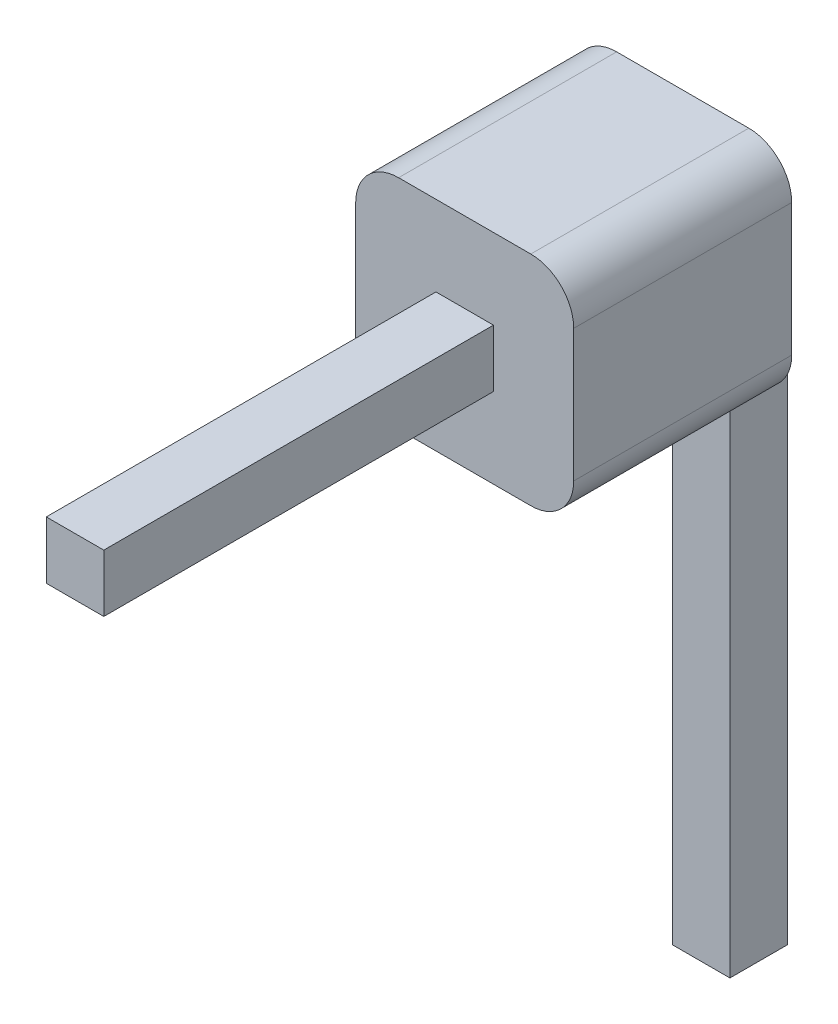
ISO-10303-21;
HEADER;
FILE_DESCRIPTION(('STEP AP214'),'2;1');
FILE_NAME('part.step','',(''),(''),'','','');
FILE_SCHEMA(('AUTOMOTIVE_DESIGN { 1 0 10303 214 1 1 1 1 }'));
ENDSEC;
DATA;
#1=APPLICATION_CONTEXT('core data for automotive mechanical design processes');
#2=APPLICATION_PROTOCOL_DEFINITION('international standard','automotive_design',2000,#1);
#3=PRODUCT_CONTEXT('',#1,'mechanical');
#4=PRODUCT('Part','Part','',(#3));
#5=PRODUCT_RELATED_PRODUCT_CATEGORY('part','',(#4));
#6=PRODUCT_DEFINITION_FORMATION('','',#4);
#7=PRODUCT_DEFINITION_CONTEXT('part definition',#1,'design');
#8=PRODUCT_DEFINITION('design','',#6,#7);
#9=PRODUCT_DEFINITION_SHAPE('','',#8);
#10=(LENGTH_UNIT() NAMED_UNIT(*) SI_UNIT(.MILLI.,.METRE.));
#11=(NAMED_UNIT(*) PLANE_ANGLE_UNIT() SI_UNIT($,.RADIAN.));
#12=(NAMED_UNIT(*) SI_UNIT($,.STERADIAN.) SOLID_ANGLE_UNIT());
#13=UNCERTAINTY_MEASURE_WITH_UNIT(LENGTH_MEASURE(1.E-05),#10,'distance_accuracy_value','');
#14=(GEOMETRIC_REPRESENTATION_CONTEXT(3) GLOBAL_UNCERTAINTY_ASSIGNED_CONTEXT((#13)) GLOBAL_UNIT_ASSIGNED_CONTEXT((#10,
#11,#12)) REPRESENTATION_CONTEXT('',''));
#15=CARTESIAN_POINT('',(0.,0.,0.));
#16=DIRECTION('',(0.,0.,1.));
#17=DIRECTION('',(1.,0.,0.));
#18=AXIS2_PLACEMENT_3D('',#15,#16,#17);
#19=CARTESIAN_POINT('',(-1.27,-0.0190907262086213,2.54));
#20=DIRECTION('',(0.,0.,1.));
#21=DIRECTION('',(1.,0.,0.));
#22=AXIS2_PLACEMENT_3D('',#19,#20,#21);
#23=PLANE('',#22);
#24=DIRECTION('',(1.,0.,0.));
#25=VECTOR('',#24,1.);
#26=CARTESIAN_POINT('',(-1.27,-2.55909072620862,2.54));
#27=LINE('',#26,#25);
#28=CARTESIAN_POINT('',(-0.769999999999999,-2.55909072620862,2.54));
#29=VERTEX_POINT('',#28);
#30=CARTESIAN_POINT('',(0.770000000000001,-2.55909072620862,2.54));
#31=VERTEX_POINT('',#30);
#32=EDGE_CURVE('E245',#29,#31,#27,.T.);
#33=ORIENTED_EDGE('',*,*,#32,.T.);
#34=CARTESIAN_POINT('',(0.770000000000001,-2.05909072620862,2.54));
#35=DIRECTION('',(0.,0.,1.));
#36=DIRECTION('',(1.,0.,0.));
#37=AXIS2_PLACEMENT_3D('',#34,#35,#36);
#38=CIRCLE('',#37,0.5);
#39=CARTESIAN_POINT('',(1.27,-2.05909072620862,2.54));
#40=VERTEX_POINT('',#39);
#41=EDGE_CURVE('E289',#31,#40,#38,.T.);
#42=ORIENTED_EDGE('',*,*,#41,.T.);
#43=DIRECTION('',(0.,1.,0.));
#44=VECTOR('',#43,1.);
#45=CARTESIAN_POINT('',(1.27,-0.019090726208621,2.54));
#46=LINE('',#45,#44);
#47=CARTESIAN_POINT('',(1.27,-0.519090726208621,2.54));
#48=VERTEX_POINT('',#47);
#49=EDGE_CURVE('E248',#40,#48,#46,.T.);
#50=ORIENTED_EDGE('',*,*,#49,.T.);
#51=CARTESIAN_POINT('',(0.770000000000001,-0.519090726208621,2.54));
#52=DIRECTION('',(0.,0.,1.));
#53=DIRECTION('',(1.,0.,0.));
#54=AXIS2_PLACEMENT_3D('',#51,#52,#53);
#55=CIRCLE('',#54,0.5);
#56=CARTESIAN_POINT('',(0.770000000000001,-0.019090726208621,2.54));
#57=VERTEX_POINT('',#56);
#58=EDGE_CURVE('E49',#48,#57,#55,.T.);
#59=ORIENTED_EDGE('',*,*,#58,.T.);
#60=DIRECTION('',(-1.,0.,0.));
#61=VECTOR('',#60,1.);
#62=CARTESIAN_POINT('',(-1.27,-0.0190907262086213,2.54));
#63=LINE('',#62,#61);
#64=CARTESIAN_POINT('',(-0.77,-0.0190907262086212,2.54));
#65=VERTEX_POINT('',#64);
#66=EDGE_CURVE('E250',#57,#65,#63,.T.);
#67=ORIENTED_EDGE('',*,*,#66,.T.);
#68=CARTESIAN_POINT('',(-0.769999999999999,-0.519090726208621,2.54));
#69=DIRECTION('',(0.,0.,1.));
#70=DIRECTION('',(1.,0.,0.));
#71=AXIS2_PLACEMENT_3D('',#68,#69,#70);
#72=CIRCLE('',#71,0.5);
#73=CARTESIAN_POINT('',(-1.27,-0.519090726208621,2.54));
#74=VERTEX_POINT('',#73);
#75=EDGE_CURVE('E285',#65,#74,#72,.T.);
#76=ORIENTED_EDGE('',*,*,#75,.T.);
#77=DIRECTION('',(0.,-1.,0.));
#78=VECTOR('',#77,1.);
#79=CARTESIAN_POINT('',(-1.27,-0.0190907262086213,2.54));
#80=LINE('',#79,#78);
#81=CARTESIAN_POINT('',(-1.27,-2.05909072620862,2.54));
#82=VERTEX_POINT('',#81);
#83=EDGE_CURVE('E242',#74,#82,#80,.T.);
#84=ORIENTED_EDGE('',*,*,#83,.T.);
#85=CARTESIAN_POINT('',(-0.769999999999999,-2.05909072620862,2.54));
#86=DIRECTION('',(0.,0.,1.));
#87=DIRECTION('',(1.,0.,0.));
#88=AXIS2_PLACEMENT_3D('',#85,#86,#87);
#89=CIRCLE('',#88,0.5);
#90=EDGE_CURVE('E287',#82,#29,#89,.T.);
#91=ORIENTED_EDGE('',*,*,#90,.T.);
#92=EDGE_LOOP('',(#33,#42,#50,#59,#67,#76,#84,#91));
#93=FACE_BOUND('',#92,.T.);
#94=DIRECTION('',(1.,0.,0.));
#95=VECTOR('',#94,1.);
#96=CARTESIAN_POINT('',(-1.27,-0.954090726208621,2.54));
#97=LINE('',#96,#95);
#98=CARTESIAN_POINT('',(-0.335,-0.954090726208621,2.54));
#99=VERTEX_POINT('',#98);
#100=CARTESIAN_POINT('',(0.335,-0.954090726208621,2.54));
#101=VERTEX_POINT('',#100);
#102=EDGE_CURVE('E262',#99,#101,#97,.T.);
#103=ORIENTED_EDGE('',*,*,#102,.T.);
#104=DIRECTION('',(0.,-1.,0.));
#105=VECTOR('',#104,1.);
#106=CARTESIAN_POINT('',(0.335000000000001,-0.0190907262086233,2.54));
#107=LINE('',#106,#105);
#108=CARTESIAN_POINT('',(0.334999999999999,-1.62409072620862,2.54));
#109=VERTEX_POINT('',#108);
#110=EDGE_CURVE('E229',#101,#109,#107,.T.);
#111=ORIENTED_EDGE('',*,*,#110,.T.);
#112=DIRECTION('',(-1.,0.,0.));
#113=VECTOR('',#112,1.);
#114=CARTESIAN_POINT('',(-1.27,-1.62409072620862,2.54));
#115=LINE('',#114,#113);
#116=CARTESIAN_POINT('',(-0.335,-1.62409072620862,2.54));
#117=VERTEX_POINT('',#116);
#118=EDGE_CURVE('E161',#109,#117,#115,.T.);
#119=ORIENTED_EDGE('',*,*,#118,.T.);
#120=DIRECTION('',(0.,1.,0.));
#121=VECTOR('',#120,1.);
#122=CARTESIAN_POINT('',(-0.335,-0.0190907262086213,2.54));
#123=LINE('',#122,#121);
#124=EDGE_CURVE('E226',#117,#99,#123,.T.);
#125=ORIENTED_EDGE('',*,*,#124,.T.);
#126=EDGE_LOOP('',(#103,#111,#119,#125));
#127=FACE_BOUND('',#126,.T.);
#128=ADVANCED_FACE('F29',(#93,#127),#23,.T.);
#129=CARTESIAN_POINT('',(-1.27,-0.0190907262086213,0.));
#130=DIRECTION('',(0.,0.,1.));
#131=DIRECTION('',(1.,0.,0.));
#132=AXIS2_PLACEMENT_3D('',#129,#130,#131);
#133=PLANE('',#132);
#134=DIRECTION('',(0.,1.,0.));
#135=VECTOR('',#134,1.);
#136=CARTESIAN_POINT('',(1.27,-0.019090726208621,0.));
#137=LINE('',#136,#135);
#138=CARTESIAN_POINT('',(1.27,-2.05909072620862,0.));
#139=VERTEX_POINT('',#138);
#140=CARTESIAN_POINT('',(1.27,-0.519090726208621,0.));
#141=VERTEX_POINT('',#140);
#142=EDGE_CURVE('E237',#139,#141,#137,.T.);
#143=ORIENTED_EDGE('',*,*,#142,.F.);
#144=CARTESIAN_POINT('',(0.770000000000001,-2.05909072620862,0.));
#145=DIRECTION('',(0.,0.,1.));
#146=DIRECTION('',(1.,0.,0.));
#147=AXIS2_PLACEMENT_3D('',#144,#145,#146);
#148=CIRCLE('',#147,0.5);
#149=CARTESIAN_POINT('',(0.770000000000001,-2.55909072620862,0.));
#150=VERTEX_POINT('',#149);
#151=EDGE_CURVE('E277',#139,#150,#148,.F.);
#152=ORIENTED_EDGE('',*,*,#151,.T.);
#153=DIRECTION('',(1.,0.,0.));
#154=VECTOR('',#153,1.);
#155=CARTESIAN_POINT('',(-1.27,-2.55909072620862,0.));
#156=LINE('',#155,#154);
#157=CARTESIAN_POINT('',(-0.769999999999999,-2.55909072620862,0.));
#158=VERTEX_POINT('',#157);
#159=EDGE_CURVE('E234',#158,#150,#156,.T.);
#160=ORIENTED_EDGE('',*,*,#159,.F.);
#161=CARTESIAN_POINT('',(-0.769999999999999,-2.05909072620862,0.));
#162=DIRECTION('',(0.,0.,1.));
#163=DIRECTION('',(1.,0.,0.));
#164=AXIS2_PLACEMENT_3D('',#161,#162,#163);
#165=CIRCLE('',#164,0.5);
#166=CARTESIAN_POINT('',(-1.27,-2.05909072620862,0.));
#167=VERTEX_POINT('',#166);
#168=EDGE_CURVE('E275',#158,#167,#165,.F.);
#169=ORIENTED_EDGE('',*,*,#168,.T.);
#170=DIRECTION('',(0.,-1.,0.));
#171=VECTOR('',#170,1.);
#172=CARTESIAN_POINT('',(-1.27,-0.0190907262086213,0.));
#173=LINE('',#172,#171);
#174=CARTESIAN_POINT('',(-1.27,-0.519090726208621,0.));
#175=VERTEX_POINT('',#174);
#176=EDGE_CURVE('E231',#175,#167,#173,.T.);
#177=ORIENTED_EDGE('',*,*,#176,.F.);
#178=CARTESIAN_POINT('',(-0.769999999999999,-0.519090726208621,0.));
#179=DIRECTION('',(0.,0.,1.));
#180=DIRECTION('',(1.,0.,0.));
#181=AXIS2_PLACEMENT_3D('',#178,#179,#180);
#182=CIRCLE('',#181,0.5);
#183=CARTESIAN_POINT('',(-0.77,-0.0190907262086212,0.));
#184=VERTEX_POINT('',#183);
#185=EDGE_CURVE('E273',#175,#184,#182,.F.);
#186=ORIENTED_EDGE('',*,*,#185,.T.);
#187=DIRECTION('',(-1.,0.,0.));
#188=VECTOR('',#187,1.);
#189=CARTESIAN_POINT('',(-1.27,-0.0190907262086213,0.));
#190=LINE('',#189,#188);
#191=CARTESIAN_POINT('',(0.770000000000001,-0.019090726208621,0.));
#192=VERTEX_POINT('',#191);
#193=EDGE_CURVE('E240',#192,#184,#190,.T.);
#194=ORIENTED_EDGE('',*,*,#193,.F.);
#195=CARTESIAN_POINT('',(0.770000000000001,-0.519090726208621,0.));
#196=DIRECTION('',(0.,0.,1.));
#197=DIRECTION('',(1.,0.,0.));
#198=AXIS2_PLACEMENT_3D('',#195,#196,#197);
#199=CIRCLE('',#198,0.5);
#200=EDGE_CURVE('E271',#192,#141,#199,.F.);
#201=ORIENTED_EDGE('',*,*,#200,.T.);
#202=EDGE_LOOP('',(#143,#152,#160,#169,#177,#186,#194,#201));
#203=FACE_BOUND('',#202,.T.);
#204=DIRECTION('',(0.,-1.,0.));
#205=VECTOR('',#204,1.);
#206=CARTESIAN_POINT('',(0.335000000000001,-0.0190907262086233,0.));
#207=LINE('',#206,#205);
#208=CARTESIAN_POINT('',(0.335,-1.13236165689398,0.));
#209=VERTEX_POINT('',#208);
#210=CARTESIAN_POINT('',(0.334999999999999,-1.97541448847849,0.));
#211=VERTEX_POINT('',#210);
#212=EDGE_CURVE('E259',#209,#211,#207,.T.);
#213=ORIENTED_EDGE('',*,*,#212,.F.);
#214=DIRECTION('',(-1.,0.,0.));
#215=VECTOR('',#214,1.);
#216=CARTESIAN_POINT('',(0.,-1.13236165689398,0.));
#217=LINE('',#216,#215);
#218=CARTESIAN_POINT('',(-0.335,-1.13236165689398,0.));
#219=VERTEX_POINT('',#218);
#220=EDGE_CURVE('E255',#209,#219,#217,.T.);
#221=ORIENTED_EDGE('',*,*,#220,.T.);
#222=DIRECTION('',(0.,1.,0.));
#223=VECTOR('',#222,1.);
#224=CARTESIAN_POINT('',(-0.335,-0.0190907262086213,0.));
#225=LINE('',#224,#223);
#226=CARTESIAN_POINT('',(-0.335,-1.97541448847849,0.));
#227=VERTEX_POINT('',#226);
#228=EDGE_CURVE('E252',#227,#219,#225,.T.);
#229=ORIENTED_EDGE('',*,*,#228,.F.);
#230=DIRECTION('',(-1.,0.,0.));
#231=VECTOR('',#230,1.);
#232=CARTESIAN_POINT('',(0.,-1.97541448847849,0.));
#233=LINE('',#232,#231);
#234=EDGE_CURVE('E257',#227,#211,#233,.F.);
#235=ORIENTED_EDGE('',*,*,#234,.T.);
#236=EDGE_LOOP('',(#213,#221,#229,#235));
#237=FACE_BOUND('',#236,.T.);
#238=ADVANCED_FACE('F302',(#203,#237),#133,.F.);
#239=CARTESIAN_POINT('',(-1.27,-0.0190907262086213,2.54));
#240=DIRECTION('',(1.,0.,0.));
#241=DIRECTION('',(0.,0.,-1.));
#242=AXIS2_PLACEMENT_3D('',#239,#240,#241);
#243=PLANE('',#242);
#244=ORIENTED_EDGE('',*,*,#176,.T.);
#245=DIRECTION('',(0.,0.,-1.));
#246=VECTOR('',#245,1.);
#247=CARTESIAN_POINT('',(-1.27,-2.05909072620862,2.54));
#248=LINE('',#247,#246);
#249=EDGE_CURVE('E294',#167,#82,#248,.F.);
#250=ORIENTED_EDGE('',*,*,#249,.T.);
#251=ORIENTED_EDGE('',*,*,#83,.F.);
#252=DIRECTION('',(0.,0.,-1.));
#253=VECTOR('',#252,1.);
#254=CARTESIAN_POINT('',(-1.27,-0.519090726208621,2.54));
#255=LINE('',#254,#253);
#256=EDGE_CURVE('E291',#74,#175,#255,.T.);
#257=ORIENTED_EDGE('',*,*,#256,.T.);
#258=EDGE_LOOP('',(#244,#250,#251,#257));
#259=FACE_BOUND('',#258,.T.);
#260=ADVANCED_FACE('F31',(#259),#243,.F.);
#261=CARTESIAN_POINT('',(-1.27,-2.55909072620862,2.54));
#262=DIRECTION('',(0.,1.,0.));
#263=DIRECTION('',(-1.,0.,0.));
#264=AXIS2_PLACEMENT_3D('',#261,#262,#263);
#265=PLANE('',#264);
#266=ORIENTED_EDGE('',*,*,#159,.T.);
#267=DIRECTION('',(0.,0.,-1.));
#268=VECTOR('',#267,1.);
#269=CARTESIAN_POINT('',(0.770000000000001,-2.55909072620862,2.54));
#270=LINE('',#269,#268);
#271=EDGE_CURVE('E282',#150,#31,#270,.F.);
#272=ORIENTED_EDGE('',*,*,#271,.T.);
#273=ORIENTED_EDGE('',*,*,#32,.F.);
#274=DIRECTION('',(0.,0.,-1.));
#275=VECTOR('',#274,1.);
#276=CARTESIAN_POINT('',(-0.769999999999999,-2.55909072620862,2.54));
#277=LINE('',#276,#275);
#278=EDGE_CURVE('E279',#29,#158,#277,.T.);
#279=ORIENTED_EDGE('',*,*,#278,.T.);
#280=EDGE_LOOP('',(#266,#272,#273,#279));
#281=FACE_BOUND('',#280,.T.);
#282=ADVANCED_FACE('F320',(#281),#265,.F.);
#283=CARTESIAN_POINT('',(1.27,-0.019090726208621,2.54));
#284=DIRECTION('',(-1.,0.,0.));
#285=DIRECTION('',(0.,0.,1.));
#286=AXIS2_PLACEMENT_3D('',#283,#284,#285);
#287=PLANE('',#286);
#288=ORIENTED_EDGE('',*,*,#49,.F.);
#289=DIRECTION('',(0.,0.,-1.));
#290=VECTOR('',#289,1.);
#291=CARTESIAN_POINT('',(1.27,-2.05909072620862,2.54));
#292=LINE('',#291,#290);
#293=EDGE_CURVE('E268',#40,#139,#292,.T.);
#294=ORIENTED_EDGE('',*,*,#293,.T.);
#295=ORIENTED_EDGE('',*,*,#142,.T.);
#296=DIRECTION('',(0.,0.,-1.));
#297=VECTOR('',#296,1.);
#298=CARTESIAN_POINT('',(1.27,-0.519090726208621,2.54));
#299=LINE('',#298,#297);
#300=EDGE_CURVE('E266',#141,#48,#299,.F.);
#301=ORIENTED_EDGE('',*,*,#300,.T.);
#302=EDGE_LOOP('',(#288,#294,#295,#301));
#303=FACE_BOUND('',#302,.T.);
#304=ADVANCED_FACE('F328',(#303),#287,.F.);
#305=CARTESIAN_POINT('',(-1.27,-0.0190907262086213,2.54));
#306=DIRECTION('',(0.,-1.,0.));
#307=DIRECTION('',(1.,0.,0.));
#308=AXIS2_PLACEMENT_3D('',#305,#306,#307);
#309=PLANE('',#308);
#310=ORIENTED_EDGE('',*,*,#193,.T.);
#311=DIRECTION('',(0.,0.,-1.));
#312=VECTOR('',#311,1.);
#313=CARTESIAN_POINT('',(-0.77,-0.0190907262086212,2.54));
#314=LINE('',#313,#312);
#315=EDGE_CURVE('E11',#184,#65,#314,.F.);
#316=ORIENTED_EDGE('',*,*,#315,.T.);
#317=ORIENTED_EDGE('',*,*,#66,.F.);
#318=DIRECTION('',(0.,0.,-1.));
#319=VECTOR('',#318,1.);
#320=CARTESIAN_POINT('',(0.770000000000001,-0.019090726208621,2.54));
#321=LINE('',#320,#319);
#322=EDGE_CURVE('E37',#57,#192,#321,.T.);
#323=ORIENTED_EDGE('',*,*,#322,.T.);
#324=EDGE_LOOP('',(#310,#316,#317,#323));
#325=FACE_BOUND('',#324,.T.);
#326=ADVANCED_FACE('F298',(#325),#309,.F.);
#327=CARTESIAN_POINT('',(0.334999999999999,-2.57909072620862,-0.215000000000003));
#328=DIRECTION('',(0.,0.,1.));
#329=DIRECTION('',(0.,-1.,0.));
#330=AXIS2_PLACEMENT_3D('',#327,#328,#329);
#331=PLANE('',#330);
#332=DIRECTION('',(-1.,0.,0.));
#333=VECTOR('',#332,1.);
#334=CARTESIAN_POINT('',(0.334999999999999,-2.57909072620862,-0.215000000000003));
#335=LINE('',#334,#333);
#336=CARTESIAN_POINT('',(0.334999999999999,-2.57909072620862,-0.215000000000003));
#337=VERTEX_POINT('',#336);
#338=CARTESIAN_POINT('',(-0.335,-2.57909072620862,-0.215000000000003));
#339=VERTEX_POINT('',#338);
#340=EDGE_CURVE('E191',#337,#339,#335,.T.);
#341=ORIENTED_EDGE('',*,*,#340,.T.);
#342=DIRECTION('',(0.,-1.,0.));
#343=VECTOR('',#342,1.);
#344=CARTESIAN_POINT('',(-0.335,-2.57909072620862,-0.215000000000003));
#345=LINE('',#344,#343);
#346=CARTESIAN_POINT('',(-0.335,-8.91909072620862,-0.215000000000003));
#347=VERTEX_POINT('',#346);
#348=EDGE_CURVE('E220',#339,#347,#345,.T.);
#349=ORIENTED_EDGE('',*,*,#348,.T.);
#350=DIRECTION('',(-1.,0.,0.));
#351=VECTOR('',#350,1.);
#352=CARTESIAN_POINT('',(0.334999999999999,-8.91909072620862,-0.215000000000003));
#353=LINE('',#352,#351);
#354=CARTESIAN_POINT('',(0.334999999999999,-8.91909072620862,-0.215000000000003));
#355=VERTEX_POINT('',#354);
#356=EDGE_CURVE('E211',#355,#347,#353,.T.);
#357=ORIENTED_EDGE('',*,*,#356,.F.);
#358=DIRECTION('',(0.,-1.,0.));
#359=VECTOR('',#358,1.);
#360=CARTESIAN_POINT('',(0.334999999999999,-2.57909072620862,-0.215000000000003));
#361=LINE('',#360,#359);
#362=EDGE_CURVE('E223',#337,#355,#361,.T.);
#363=ORIENTED_EDGE('',*,*,#362,.F.);
#364=EDGE_LOOP('',(#341,#349,#357,#363));
#365=FACE_BOUND('',#364,.T.);
#366=ADVANCED_FACE('F348',(#365),#331,.T.);
#367=CARTESIAN_POINT('',(0.335,-8.91909072620862,-0.885000000000003));
#368=DIRECTION('',(0.,-1.,0.));
#369=DIRECTION('',(-1.,0.,0.));
#370=AXIS2_PLACEMENT_3D('',#367,#368,#369);
#371=PLANE('',#370);
#372=DIRECTION('',(0.,0.,1.));
#373=VECTOR('',#372,1.);
#374=CARTESIAN_POINT('',(0.335,-8.91909072620862,-0.885000000000003));
#375=LINE('',#374,#373);
#376=CARTESIAN_POINT('',(0.335,-8.91909072620862,-0.885000000000003));
#377=VERTEX_POINT('',#376);
#378=EDGE_CURVE('E202',#377,#355,#375,.T.);
#379=ORIENTED_EDGE('',*,*,#378,.T.);
#380=ORIENTED_EDGE('',*,*,#356,.T.);
#381=DIRECTION('',(0.,0.,-1.));
#382=VECTOR('',#381,1.);
#383=CARTESIAN_POINT('',(-0.335,-8.91909072620862,-0.885000000000003));
#384=LINE('',#383,#382);
#385=CARTESIAN_POINT('',(-0.335,-8.91909072620862,-0.885000000000003));
#386=VERTEX_POINT('',#385);
#387=EDGE_CURVE('E208',#347,#386,#384,.T.);
#388=ORIENTED_EDGE('',*,*,#387,.T.);
#389=DIRECTION('',(1.,0.,0.));
#390=VECTOR('',#389,1.);
#391=CARTESIAN_POINT('',(0.335,-8.91909072620862,-0.885000000000003));
#392=LINE('',#391,#390);
#393=EDGE_CURVE('E205',#386,#377,#392,.T.);
#394=ORIENTED_EDGE('',*,*,#393,.T.);
#395=EDGE_LOOP('',(#379,#380,#388,#394));
#396=FACE_BOUND('',#395,.T.);
#397=ADVANCED_FACE('F373',(#396),#371,.T.);
#398=CARTESIAN_POINT('',(0.335,-2.57909072620862,-0.885000000000002));
#399=DIRECTION('',(0.,0.,-1.));
#400=DIRECTION('',(-1.,0.,0.));
#401=AXIS2_PLACEMENT_3D('',#398,#399,#400);
#402=PLANE('',#401);
#403=DIRECTION('',(1.,0.,0.));
#404=VECTOR('',#403,1.);
#405=CARTESIAN_POINT('',(0.335,-2.57909072620862,-0.885000000000002));
#406=LINE('',#405,#404);
#407=CARTESIAN_POINT('',(-0.335,-2.57909072620862,-0.885000000000002));
#408=VERTEX_POINT('',#407);
#409=CARTESIAN_POINT('',(0.335,-2.57909072620862,-0.885000000000002));
#410=VERTEX_POINT('',#409);
#411=EDGE_CURVE('E166',#408,#410,#406,.T.);
#412=ORIENTED_EDGE('',*,*,#411,.T.);
#413=DIRECTION('',(0.,-1.,0.));
#414=VECTOR('',#413,1.);
#415=CARTESIAN_POINT('',(0.335,-2.57909072620862,-0.885000000000002));
#416=LINE('',#415,#414);
#417=EDGE_CURVE('E214',#410,#377,#416,.T.);
#418=ORIENTED_EDGE('',*,*,#417,.T.);
#419=ORIENTED_EDGE('',*,*,#393,.F.);
#420=DIRECTION('',(0.,-1.,0.));
#421=VECTOR('',#420,1.);
#422=CARTESIAN_POINT('',(-0.335,-2.57909072620862,-0.885000000000002));
#423=LINE('',#422,#421);
#424=EDGE_CURVE('E217',#408,#386,#423,.T.);
#425=ORIENTED_EDGE('',*,*,#424,.F.);
#426=EDGE_LOOP('',(#412,#418,#419,#425));
#427=FACE_BOUND('',#426,.T.);
#428=ADVANCED_FACE('F380',(#427),#402,.T.);
#429=CARTESIAN_POINT('',(-0.335,-0.954090726208621,0.739999999999999));
#430=DIRECTION('',(1.,0.,0.));
#431=DIRECTION('',(0.,0.,-1.));
#432=AXIS2_PLACEMENT_3D('',#429,#430,#431);
#433=PLANE('',#432);
#434=CARTESIAN_POINT('',(-0.335,-2.57909072620862,0.739999999999999));
#435=DIRECTION('',(-1.,0.,0.));
#436=DIRECTION('',(0.,0.,1.));
#437=AXIS2_PLACEMENT_3D('',#434,#435,#436);
#438=CIRCLE('',#437,0.955000000000002);
#439=EDGE_CURVE('E198',#227,#339,#438,.T.);
#440=ORIENTED_EDGE('',*,*,#439,.F.);
#441=ORIENTED_EDGE('',*,*,#228,.T.);
#442=CARTESIAN_POINT('',(-0.335,-2.57909072620862,0.739999999999999));
#443=DIRECTION('',(-1.,0.,0.));
#444=DIRECTION('',(0.,0.,1.));
#445=AXIS2_PLACEMENT_3D('',#442,#443,#444);
#446=CIRCLE('',#445,1.625);
#447=EDGE_CURVE('E196',#219,#408,#446,.T.);
#448=ORIENTED_EDGE('',*,*,#447,.T.);
#449=ORIENTED_EDGE('',*,*,#424,.T.);
#450=ORIENTED_EDGE('',*,*,#387,.F.);
#451=ORIENTED_EDGE('',*,*,#348,.F.);
#452=EDGE_LOOP('',(#440,#441,#448,#449,#450,#451));
#453=FACE_BOUND('',#452,.T.);
#454=ADVANCED_FACE('F388',(#453),#433,.F.);
#455=CARTESIAN_POINT('',(0.335,-0.954090726208621,0.739999999999999));
#456=DIRECTION('',(-1.,0.,0.));
#457=DIRECTION('',(0.,-1.,0.));
#458=AXIS2_PLACEMENT_3D('',#455,#456,#457);
#459=PLANE('',#458);
#460=CARTESIAN_POINT('',(0.335,-2.57909072620862,0.739999999999999));
#461=DIRECTION('',(-1.,0.,0.));
#462=DIRECTION('',(0.,0.,1.));
#463=AXIS2_PLACEMENT_3D('',#460,#461,#462);
#464=CIRCLE('',#463,1.625);
#465=EDGE_CURVE('E194',#209,#410,#464,.T.);
#466=ORIENTED_EDGE('',*,*,#465,.F.);
#467=ORIENTED_EDGE('',*,*,#212,.T.);
#468=CARTESIAN_POINT('',(0.334999999999999,-2.57909072620862,0.739999999999999));
#469=DIRECTION('',(-1.,0.,0.));
#470=DIRECTION('',(0.,0.,1.));
#471=AXIS2_PLACEMENT_3D('',#468,#469,#470);
#472=CIRCLE('',#471,0.955000000000002);
#473=EDGE_CURVE('E200',#211,#337,#472,.T.);
#474=ORIENTED_EDGE('',*,*,#473,.T.);
#475=ORIENTED_EDGE('',*,*,#362,.T.);
#476=ORIENTED_EDGE('',*,*,#378,.F.);
#477=ORIENTED_EDGE('',*,*,#417,.F.);
#478=EDGE_LOOP('',(#466,#467,#474,#475,#476,#477));
#479=FACE_BOUND('',#478,.T.);
#480=ADVANCED_FACE('F396',(#479),#459,.F.);
#481=CARTESIAN_POINT('',(0.,-2.57909072620862,0.739999999999999));
#482=DIRECTION('',(-1.,0.,0.));
#483=DIRECTION('',(0.,0.,1.));
#484=AXIS2_PLACEMENT_3D('',#481,#482,#483);
#485=CYLINDRICAL_SURFACE('',#484,1.625);
#486=ORIENTED_EDGE('',*,*,#220,.F.);
#487=ORIENTED_EDGE('',*,*,#465,.T.);
#488=ORIENTED_EDGE('',*,*,#411,.F.);
#489=ORIENTED_EDGE('',*,*,#447,.F.);
#490=EDGE_LOOP('',(#486,#487,#488,#489));
#491=FACE_BOUND('',#490,.T.);
#492=ADVANCED_FACE('F411',(#491),#485,.T.);
#493=CARTESIAN_POINT('',(0.,-2.57909072620862,0.739999999999999));
#494=DIRECTION('',(-1.,0.,0.));
#495=DIRECTION('',(0.,0.,1.));
#496=AXIS2_PLACEMENT_3D('',#493,#494,#495);
#497=CYLINDRICAL_SURFACE('',#496,0.955000000000002);
#498=ORIENTED_EDGE('',*,*,#234,.F.);
#499=ORIENTED_EDGE('',*,*,#439,.T.);
#500=ORIENTED_EDGE('',*,*,#340,.F.);
#501=ORIENTED_EDGE('',*,*,#473,.F.);
#502=EDGE_LOOP('',(#498,#499,#500,#501));
#503=FACE_BOUND('',#502,.T.);
#504=ADVANCED_FACE('F425',(#503),#497,.F.);
#505=ORIENTED_EDGE('',*,*,#110,.F.);
#506=DIRECTION('',(0.,0.,1.));
#507=VECTOR('',#506,1.);
#508=CARTESIAN_POINT('',(0.335,-0.954090726208621,0.739999999999999));
#509=LINE('',#508,#507);
#510=CARTESIAN_POINT('',(0.335,-0.954090726208622,7.08));
#511=VERTEX_POINT('',#510);
#512=EDGE_CURVE('E178',#101,#511,#509,.T.);
#513=ORIENTED_EDGE('',*,*,#512,.T.);
#514=DIRECTION('',(0.,-1.,0.));
#515=VECTOR('',#514,1.);
#516=CARTESIAN_POINT('',(0.335,-0.954090726208622,7.08));
#517=LINE('',#516,#515);
#518=CARTESIAN_POINT('',(0.334999999999999,-1.62409072620862,7.08));
#519=VERTEX_POINT('',#518);
#520=EDGE_CURVE('E173',#511,#519,#517,.T.);
#521=ORIENTED_EDGE('',*,*,#520,.T.);
#522=DIRECTION('',(0.,0.,1.));
#523=VECTOR('',#522,1.);
#524=CARTESIAN_POINT('',(0.334999999999999,-1.62409072620862,0.739999999999999));
#525=LINE('',#524,#523);
#526=EDGE_CURVE('E154',#109,#519,#525,.T.);
#527=ORIENTED_EDGE('',*,*,#526,.F.);
#528=EDGE_LOOP('',(#505,#513,#521,#527));
#529=FACE_BOUND('',#528,.T.);
#530=ADVANCED_FACE('F177',(#529),#459,.F.);
#531=CARTESIAN_POINT('',(0.334999999999999,-1.62409072620862,0.739999999999999));
#532=DIRECTION('',(0.,1.,0.));
#533=DIRECTION('',(0.,0.,1.));
#534=AXIS2_PLACEMENT_3D('',#531,#532,#533);
#535=PLANE('',#534);
#536=ORIENTED_EDGE('',*,*,#118,.F.);
#537=ORIENTED_EDGE('',*,*,#526,.T.);
#538=DIRECTION('',(-1.,0.,0.));
#539=VECTOR('',#538,1.);
#540=CARTESIAN_POINT('',(0.334999999999999,-1.62409072620862,7.08));
#541=LINE('',#540,#539);
#542=CARTESIAN_POINT('',(-0.335,-1.62409072620862,7.08));
#543=VERTEX_POINT('',#542);
#544=EDGE_CURVE('E158',#519,#543,#541,.T.);
#545=ORIENTED_EDGE('',*,*,#544,.T.);
#546=DIRECTION('',(0.,0.,1.));
#547=VECTOR('',#546,1.);
#548=CARTESIAN_POINT('',(-0.335,-1.62409072620862,0.739999999999999));
#549=LINE('',#548,#547);
#550=EDGE_CURVE('E167',#117,#543,#549,.T.);
#551=ORIENTED_EDGE('',*,*,#550,.F.);
#552=EDGE_LOOP('',(#536,#537,#545,#551));
#553=FACE_BOUND('',#552,.T.);
#554=ADVANCED_FACE('F156',(#553),#535,.F.);
#555=ORIENTED_EDGE('',*,*,#124,.F.);
#556=ORIENTED_EDGE('',*,*,#550,.T.);
#557=DIRECTION('',(0.,1.,0.));
#558=VECTOR('',#557,1.);
#559=CARTESIAN_POINT('',(-0.335,-0.954090726208621,7.08));
#560=LINE('',#559,#558);
#561=CARTESIAN_POINT('',(-0.335,-0.954090726208621,7.08));
#562=VERTEX_POINT('',#561);
#563=EDGE_CURVE('E175',#543,#562,#560,.T.);
#564=ORIENTED_EDGE('',*,*,#563,.T.);
#565=DIRECTION('',(0.,0.,1.));
#566=VECTOR('',#565,1.);
#567=CARTESIAN_POINT('',(-0.335,-0.954090726208621,0.739999999999999));
#568=LINE('',#567,#566);
#569=EDGE_CURVE('E186',#99,#562,#568,.T.);
#570=ORIENTED_EDGE('',*,*,#569,.F.);
#571=EDGE_LOOP('',(#555,#556,#564,#570));
#572=FACE_BOUND('',#571,.T.);
#573=ADVANCED_FACE('F399',(#572),#433,.F.);
#574=CARTESIAN_POINT('',(0.335,-0.954090726208621,0.739999999999999));
#575=DIRECTION('',(0.,-1.,0.));
#576=DIRECTION('',(1.,0.,0.));
#577=AXIS2_PLACEMENT_3D('',#574,#575,#576);
#578=PLANE('',#577);
#579=ORIENTED_EDGE('',*,*,#102,.F.);
#580=ORIENTED_EDGE('',*,*,#569,.T.);
#581=DIRECTION('',(1.,0.,0.));
#582=VECTOR('',#581,1.);
#583=CARTESIAN_POINT('',(0.335,-0.954090726208622,7.08));
#584=LINE('',#583,#582);
#585=EDGE_CURVE('E183',#562,#511,#584,.T.);
#586=ORIENTED_EDGE('',*,*,#585,.T.);
#587=ORIENTED_EDGE('',*,*,#512,.F.);
#588=EDGE_LOOP('',(#579,#580,#586,#587));
#589=FACE_BOUND('',#588,.T.);
#590=ADVANCED_FACE('F457',(#589),#578,.F.);
#591=CARTESIAN_POINT('',(0.335,-0.954090726208622,7.08));
#592=DIRECTION('',(0.,0.,-1.));
#593=DIRECTION('',(-1.,0.,0.));
#594=AXIS2_PLACEMENT_3D('',#591,#592,#593);
#595=PLANE('',#594);
#596=ORIENTED_EDGE('',*,*,#520,.F.);
#597=ORIENTED_EDGE('',*,*,#585,.F.);
#598=ORIENTED_EDGE('',*,*,#563,.F.);
#599=ORIENTED_EDGE('',*,*,#544,.F.);
#600=EDGE_LOOP('',(#596,#597,#598,#599));
#601=FACE_BOUND('',#600,.T.);
#602=ADVANCED_FACE('F171',(#601),#595,.F.);
#603=CARTESIAN_POINT('',(0.770000000000001,-2.05909072620862,2.54));
#604=DIRECTION('',(0.,0.,-1.));
#605=DIRECTION('',(-1.,0.,0.));
#606=AXIS2_PLACEMENT_3D('',#603,#604,#605);
#607=CYLINDRICAL_SURFACE('',#606,0.5);
#608=ORIENTED_EDGE('',*,*,#41,.F.);
#609=ORIENTED_EDGE('',*,*,#271,.F.);
#610=ORIENTED_EDGE('',*,*,#151,.F.);
#611=ORIENTED_EDGE('',*,*,#293,.F.);
#612=EDGE_LOOP('',(#608,#609,#610,#611));
#613=FACE_BOUND('',#612,.T.);
#614=ADVANCED_FACE('F325',(#613),#607,.T.);
#615=CARTESIAN_POINT('',(-0.769999999999999,-2.05909072620862,2.54));
#616=DIRECTION('',(0.,0.,-1.));
#617=DIRECTION('',(-1.,0.,0.));
#618=AXIS2_PLACEMENT_3D('',#615,#616,#617);
#619=CYLINDRICAL_SURFACE('',#618,0.5);
#620=ORIENTED_EDGE('',*,*,#90,.F.);
#621=ORIENTED_EDGE('',*,*,#249,.F.);
#622=ORIENTED_EDGE('',*,*,#168,.F.);
#623=ORIENTED_EDGE('',*,*,#278,.F.);
#624=EDGE_LOOP('',(#620,#621,#622,#623));
#625=FACE_BOUND('',#624,.T.);
#626=ADVANCED_FACE('F317',(#625),#619,.T.);
#627=CARTESIAN_POINT('',(-0.769999999999999,-0.519090726208621,2.54));
#628=DIRECTION('',(0.,0.,-1.));
#629=DIRECTION('',(-1.,0.,0.));
#630=AXIS2_PLACEMENT_3D('',#627,#628,#629);
#631=CYLINDRICAL_SURFACE('',#630,0.5);
#632=ORIENTED_EDGE('',*,*,#75,.F.);
#633=ORIENTED_EDGE('',*,*,#315,.F.);
#634=ORIENTED_EDGE('',*,*,#185,.F.);
#635=ORIENTED_EDGE('',*,*,#256,.F.);
#636=EDGE_LOOP('',(#632,#633,#634,#635));
#637=FACE_BOUND('',#636,.T.);
#638=ADVANCED_FACE('F308',(#637),#631,.T.);
#639=CARTESIAN_POINT('',(0.770000000000001,-0.519090726208621,2.54));
#640=DIRECTION('',(0.,0.,-1.));
#641=DIRECTION('',(-1.,0.,0.));
#642=AXIS2_PLACEMENT_3D('',#639,#640,#641);
#643=CYLINDRICAL_SURFACE('',#642,0.5);
#644=ORIENTED_EDGE('',*,*,#58,.F.);
#645=ORIENTED_EDGE('',*,*,#300,.F.);
#646=ORIENTED_EDGE('',*,*,#200,.F.);
#647=ORIENTED_EDGE('',*,*,#322,.F.);
#648=EDGE_LOOP('',(#644,#645,#646,#647));
#649=FACE_BOUND('',#648,.T.);
#650=ADVANCED_FACE('F330',(#649),#643,.T.);
#651=CLOSED_SHELL('',(#128,#238,#260,#282,#304,#326,#366,#397,#428,#454,#480,#492,#504,#530,
#554,#573,#590,#602,#614,#626,#638,#650));
#652=MANIFOLD_SOLID_BREP('B2',#651);
#653=ADVANCED_BREP_SHAPE_REPRESENTATION('',(#18,#652),#14);
#654=SHAPE_DEFINITION_REPRESENTATION(#9,#653);
ENDSEC;
END-ISO-10303-21;
